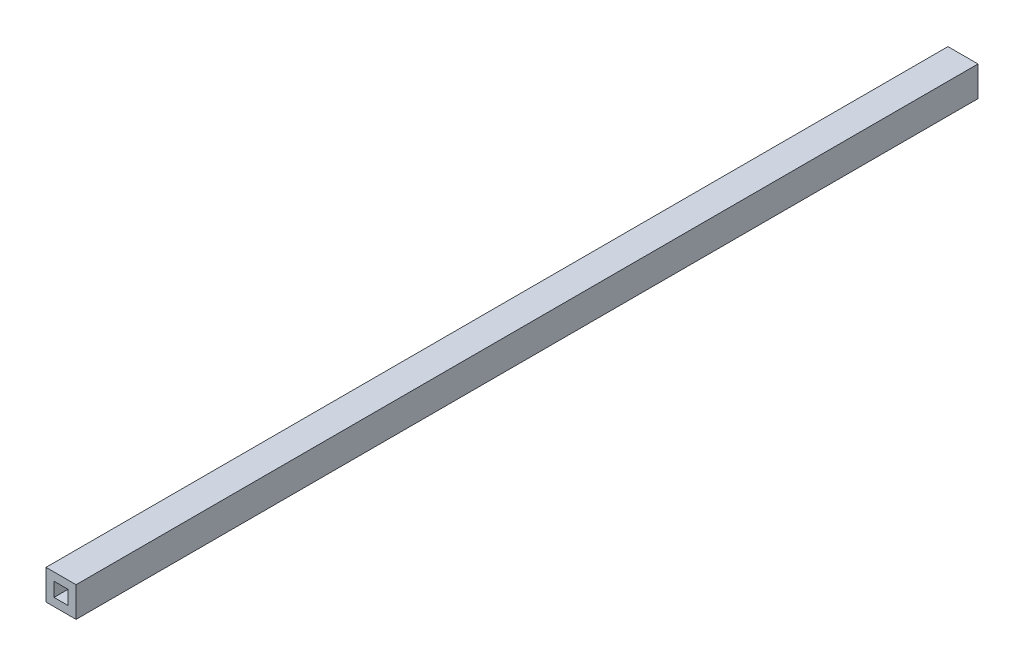
ISO-10303-21;
HEADER;
FILE_DESCRIPTION(('STEP AP214'),'2;1');
FILE_NAME('part.step','',(''),(''),'','','');
FILE_SCHEMA(('AUTOMOTIVE_DESIGN { 1 0 10303 214 1 1 1 1 }'));
ENDSEC;
DATA;
#1=APPLICATION_CONTEXT('core data for automotive mechanical design processes');
#2=APPLICATION_PROTOCOL_DEFINITION('international standard','automotive_design',2000,#1);
#3=PRODUCT_CONTEXT('',#1,'mechanical');
#4=PRODUCT('Part','Part','',(#3));
#5=PRODUCT_RELATED_PRODUCT_CATEGORY('part','',(#4));
#6=PRODUCT_DEFINITION_FORMATION('','',#4);
#7=PRODUCT_DEFINITION_CONTEXT('part definition',#1,'design');
#8=PRODUCT_DEFINITION('design','',#6,#7);
#9=PRODUCT_DEFINITION_SHAPE('','',#8);
#10=(LENGTH_UNIT() NAMED_UNIT(*) SI_UNIT(.MILLI.,.METRE.));
#11=(NAMED_UNIT(*) PLANE_ANGLE_UNIT() SI_UNIT($,.RADIAN.));
#12=(NAMED_UNIT(*) SI_UNIT($,.STERADIAN.) SOLID_ANGLE_UNIT());
#13=UNCERTAINTY_MEASURE_WITH_UNIT(LENGTH_MEASURE(1.E-05),#10,'distance_accuracy_value','');
#14=(GEOMETRIC_REPRESENTATION_CONTEXT(3) GLOBAL_UNCERTAINTY_ASSIGNED_CONTEXT((#13)) GLOBAL_UNIT_ASSIGNED_CONTEXT((#10,
#11,#12)) REPRESENTATION_CONTEXT('',''));
#15=CARTESIAN_POINT('',(0.,0.,0.));
#16=DIRECTION('',(0.,0.,1.));
#17=DIRECTION('',(1.,0.,0.));
#18=AXIS2_PLACEMENT_3D('',#15,#16,#17);
#19=CARTESIAN_POINT('',(0.,0.,571.5));
#20=DIRECTION('',(0.,0.,1.));
#21=DIRECTION('',(1.,0.,0.));
#22=AXIS2_PLACEMENT_3D('',#19,#20,#21);
#23=PLANE('',#22);
#24=DIRECTION('',(0.,-1.,0.));
#25=VECTOR('',#24,1.);
#26=CARTESIAN_POINT('',(-5.94468085106383,3.44521276595745,571.5));
#27=LINE('',#26,#25);
#28=CARTESIAN_POINT('',(-5.94468085106383,3.44521276595745,571.5));
#29=VERTEX_POINT('',#28);
#30=CARTESIAN_POINT('',(-5.94468085106383,-15.6047872340426,571.5));
#31=VERTEX_POINT('',#30);
#32=EDGE_CURVE('E134',#29,#31,#27,.T.);
#33=ORIENTED_EDGE('',*,*,#32,.T.);
#34=DIRECTION('',(1.,0.,0.));
#35=VECTOR('',#34,1.);
#36=CARTESIAN_POINT('',(-5.94468085106383,-15.6047872340426,571.5));
#37=LINE('',#36,#35);
#38=CARTESIAN_POINT('',(13.1053191489362,-15.6047872340426,571.5));
#39=VERTEX_POINT('',#38);
#40=EDGE_CURVE('E137',#31,#39,#37,.T.);
#41=ORIENTED_EDGE('',*,*,#40,.T.);
#42=DIRECTION('',(0.,1.,0.));
#43=VECTOR('',#42,1.);
#44=CARTESIAN_POINT('',(13.1053191489362,3.44521276595745,571.5));
#45=LINE('',#44,#43);
#46=CARTESIAN_POINT('',(13.1053191489362,3.44521276595745,571.5));
#47=VERTEX_POINT('',#46);
#48=EDGE_CURVE('E140',#39,#47,#45,.T.);
#49=ORIENTED_EDGE('',*,*,#48,.T.);
#50=DIRECTION('',(-1.,0.,0.));
#51=VECTOR('',#50,1.);
#52=CARTESIAN_POINT('',(-5.94468085106383,3.44521276595745,571.5));
#53=LINE('',#52,#51);
#54=EDGE_CURVE('E142',#47,#29,#53,.T.);
#55=ORIENTED_EDGE('',*,*,#54,.T.);
#56=EDGE_LOOP('',(#33,#41,#49,#55));
#57=FACE_BOUND('',#56,.T.);
#58=DIRECTION('',(1.,0.,0.));
#59=VECTOR('',#58,1.);
#60=CARTESIAN_POINT('',(-0.864680851063828,-10.5247872340426,571.5));
#61=LINE('',#60,#59);
#62=CARTESIAN_POINT('',(-0.864680851063828,-10.5247872340426,571.5));
#63=VERTEX_POINT('',#62);
#64=CARTESIAN_POINT('',(8.02531914893617,-10.5247872340426,571.5));
#65=VERTEX_POINT('',#64);
#66=EDGE_CURVE('E106',#63,#65,#61,.T.);
#67=ORIENTED_EDGE('',*,*,#66,.F.);
#68=DIRECTION('',(0.,-1.,0.));
#69=VECTOR('',#68,1.);
#70=CARTESIAN_POINT('',(-0.864680851063829,-1.63478723404256,571.5));
#71=LINE('',#70,#69);
#72=CARTESIAN_POINT('',(-0.864680851063829,-1.63478723404256,571.5));
#73=VERTEX_POINT('',#72);
#74=EDGE_CURVE('E98',#73,#63,#71,.T.);
#75=ORIENTED_EDGE('',*,*,#74,.F.);
#76=DIRECTION('',(-1.,0.,0.));
#77=VECTOR('',#76,1.);
#78=CARTESIAN_POINT('',(-0.864680851063829,-1.63478723404256,571.5));
#79=LINE('',#78,#77);
#80=CARTESIAN_POINT('',(8.02531914893617,-1.63478723404255,571.5));
#81=VERTEX_POINT('',#80);
#82=EDGE_CURVE('E120',#81,#73,#79,.T.);
#83=ORIENTED_EDGE('',*,*,#82,.F.);
#84=DIRECTION('',(0.,1.,0.));
#85=VECTOR('',#84,1.);
#86=CARTESIAN_POINT('',(8.02531914893617,-1.63478723404255,571.5));
#87=LINE('',#86,#85);
#88=EDGE_CURVE('E118',#65,#81,#87,.T.);
#89=ORIENTED_EDGE('',*,*,#88,.F.);
#90=EDGE_LOOP('',(#67,#75,#83,#89));
#91=FACE_BOUND('',#90,.T.);
#92=ADVANCED_FACE('F33',(#57,#91),#23,.T.);
#93=CARTESIAN_POINT('',(0.,0.,0.));
#94=DIRECTION('',(0.,0.,1.));
#95=DIRECTION('',(1.,0.,0.));
#96=AXIS2_PLACEMENT_3D('',#93,#94,#95);
#97=PLANE('',#96);
#98=DIRECTION('',(0.,-1.,0.));
#99=VECTOR('',#98,1.);
#100=CARTESIAN_POINT('',(-5.94468085106383,3.44521276595745,0.));
#101=LINE('',#100,#99);
#102=CARTESIAN_POINT('',(-5.94468085106383,3.44521276595745,0.));
#103=VERTEX_POINT('',#102);
#104=CARTESIAN_POINT('',(-5.94468085106383,-15.6047872340426,0.));
#105=VERTEX_POINT('',#104);
#106=EDGE_CURVE('E114',#103,#105,#101,.T.);
#107=ORIENTED_EDGE('',*,*,#106,.F.);
#108=DIRECTION('',(-1.,0.,0.));
#109=VECTOR('',#108,1.);
#110=CARTESIAN_POINT('',(-5.94468085106383,3.44521276595745,0.));
#111=LINE('',#110,#109);
#112=CARTESIAN_POINT('',(13.1053191489362,3.44521276595745,0.));
#113=VERTEX_POINT('',#112);
#114=EDGE_CURVE('E138',#113,#103,#111,.T.);
#115=ORIENTED_EDGE('',*,*,#114,.F.);
#116=DIRECTION('',(0.,1.,0.));
#117=VECTOR('',#116,1.);
#118=CARTESIAN_POINT('',(13.1053191489362,3.44521276595745,0.));
#119=LINE('',#118,#117);
#120=CARTESIAN_POINT('',(13.1053191489362,-15.6047872340426,0.));
#121=VERTEX_POINT('',#120);
#122=EDGE_CURVE('E149',#121,#113,#119,.T.);
#123=ORIENTED_EDGE('',*,*,#122,.F.);
#124=DIRECTION('',(1.,0.,0.));
#125=VECTOR('',#124,1.);
#126=CARTESIAN_POINT('',(-5.94468085106383,-15.6047872340426,0.));
#127=LINE('',#126,#125);
#128=EDGE_CURVE('E147',#105,#121,#127,.T.);
#129=ORIENTED_EDGE('',*,*,#128,.F.);
#130=EDGE_LOOP('',(#107,#115,#123,#129));
#131=FACE_BOUND('',#130,.T.);
#132=DIRECTION('',(0.,-1.,0.));
#133=VECTOR('',#132,1.);
#134=CARTESIAN_POINT('',(-0.864680851063829,-1.63478723404256,0.));
#135=LINE('',#134,#133);
#136=CARTESIAN_POINT('',(-0.864680851063829,-1.63478723404256,0.));
#137=VERTEX_POINT('',#136);
#138=CARTESIAN_POINT('',(-0.864680851063828,-10.5247872340426,0.));
#139=VERTEX_POINT('',#138);
#140=EDGE_CURVE('E56',#137,#139,#135,.T.);
#141=ORIENTED_EDGE('',*,*,#140,.T.);
#142=DIRECTION('',(1.,0.,0.));
#143=VECTOR('',#142,1.);
#144=CARTESIAN_POINT('',(-0.864680851063828,-10.5247872340426,0.));
#145=LINE('',#144,#143);
#146=CARTESIAN_POINT('',(8.02531914893617,-10.5247872340426,0.));
#147=VERTEX_POINT('',#146);
#148=EDGE_CURVE('E113',#139,#147,#145,.T.);
#149=ORIENTED_EDGE('',*,*,#148,.T.);
#150=DIRECTION('',(0.,1.,0.));
#151=VECTOR('',#150,1.);
#152=CARTESIAN_POINT('',(8.02531914893617,-1.63478723404255,0.));
#153=LINE('',#152,#151);
#154=CARTESIAN_POINT('',(8.02531914893617,-1.63478723404255,0.));
#155=VERTEX_POINT('',#154);
#156=EDGE_CURVE('E126',#147,#155,#153,.T.);
#157=ORIENTED_EDGE('',*,*,#156,.T.);
#158=DIRECTION('',(-1.,0.,0.));
#159=VECTOR('',#158,1.);
#160=CARTESIAN_POINT('',(-0.864680851063829,-1.63478723404256,0.));
#161=LINE('',#160,#159);
#162=EDGE_CURVE('E107',#155,#137,#161,.T.);
#163=ORIENTED_EDGE('',*,*,#162,.T.);
#164=EDGE_LOOP('',(#141,#149,#157,#163));
#165=FACE_BOUND('',#164,.T.);
#166=ADVANCED_FACE('F167',(#131,#165),#97,.F.);
#167=CARTESIAN_POINT('',(-5.94468085106383,3.44521276595745,571.5));
#168=DIRECTION('',(1.,0.,0.));
#169=DIRECTION('',(0.,1.,0.));
#170=AXIS2_PLACEMENT_3D('',#167,#168,#169);
#171=PLANE('',#170);
#172=ORIENTED_EDGE('',*,*,#106,.T.);
#173=DIRECTION('',(0.,0.,-1.));
#174=VECTOR('',#173,1.);
#175=CARTESIAN_POINT('',(-5.94468085106383,-15.6047872340426,571.5));
#176=LINE('',#175,#174);
#177=EDGE_CURVE('E11',#31,#105,#176,.T.);
#178=ORIENTED_EDGE('',*,*,#177,.F.);
#179=ORIENTED_EDGE('',*,*,#32,.F.);
#180=DIRECTION('',(0.,0.,-1.));
#181=VECTOR('',#180,1.);
#182=CARTESIAN_POINT('',(-5.94468085106383,3.44521276595745,571.5));
#183=LINE('',#182,#181);
#184=EDGE_CURVE('E144',#29,#103,#183,.T.);
#185=ORIENTED_EDGE('',*,*,#184,.T.);
#186=EDGE_LOOP('',(#172,#178,#179,#185));
#187=FACE_BOUND('',#186,.T.);
#188=ADVANCED_FACE('F35',(#187),#171,.F.);
#189=CARTESIAN_POINT('',(-5.94468085106383,-15.6047872340426,571.5));
#190=DIRECTION('',(0.,1.,0.));
#191=DIRECTION('',(0.,0.,1.));
#192=AXIS2_PLACEMENT_3D('',#189,#190,#191);
#193=PLANE('',#192);
#194=ORIENTED_EDGE('',*,*,#128,.T.);
#195=DIRECTION('',(0.,0.,-1.));
#196=VECTOR('',#195,1.);
#197=CARTESIAN_POINT('',(13.1053191489362,-15.6047872340426,571.5));
#198=LINE('',#197,#196);
#199=EDGE_CURVE('E41',#39,#121,#198,.T.);
#200=ORIENTED_EDGE('',*,*,#199,.F.);
#201=ORIENTED_EDGE('',*,*,#40,.F.);
#202=ORIENTED_EDGE('',*,*,#177,.T.);
#203=EDGE_LOOP('',(#194,#200,#201,#202));
#204=FACE_BOUND('',#203,.T.);
#205=ADVANCED_FACE('F177',(#204),#193,.F.);
#206=CARTESIAN_POINT('',(13.1053191489362,3.44521276595745,571.5));
#207=DIRECTION('',(-1.,0.,0.));
#208=DIRECTION('',(0.,-1.,0.));
#209=AXIS2_PLACEMENT_3D('',#206,#207,#208);
#210=PLANE('',#209);
#211=ORIENTED_EDGE('',*,*,#122,.T.);
#212=DIRECTION('',(0.,0.,-1.));
#213=VECTOR('',#212,1.);
#214=CARTESIAN_POINT('',(13.1053191489362,3.44521276595745,571.5));
#215=LINE('',#214,#213);
#216=EDGE_CURVE('E154',#47,#113,#215,.T.);
#217=ORIENTED_EDGE('',*,*,#216,.F.);
#218=ORIENTED_EDGE('',*,*,#48,.F.);
#219=ORIENTED_EDGE('',*,*,#199,.T.);
#220=EDGE_LOOP('',(#211,#217,#218,#219));
#221=FACE_BOUND('',#220,.T.);
#222=ADVANCED_FACE('F161',(#221),#210,.F.);
#223=CARTESIAN_POINT('',(-5.94468085106383,3.44521276595745,571.5));
#224=DIRECTION('',(0.,-1.,0.));
#225=DIRECTION('',(0.,0.,-1.));
#226=AXIS2_PLACEMENT_3D('',#223,#224,#225);
#227=PLANE('',#226);
#228=ORIENTED_EDGE('',*,*,#114,.T.);
#229=ORIENTED_EDGE('',*,*,#184,.F.);
#230=ORIENTED_EDGE('',*,*,#54,.F.);
#231=ORIENTED_EDGE('',*,*,#216,.T.);
#232=EDGE_LOOP('',(#228,#229,#230,#231));
#233=FACE_BOUND('',#232,.T.);
#234=ADVANCED_FACE('F171',(#233),#227,.F.);
#235=CARTESIAN_POINT('',(-0.864680851063829,-1.63478723404256,571.5));
#236=DIRECTION('',(1.,0.,0.));
#237=DIRECTION('',(0.,1.,0.));
#238=AXIS2_PLACEMENT_3D('',#235,#236,#237);
#239=PLANE('',#238);
#240=ORIENTED_EDGE('',*,*,#140,.F.);
#241=DIRECTION('',(0.,0.,-1.));
#242=VECTOR('',#241,1.);
#243=CARTESIAN_POINT('',(-0.864680851063829,-1.63478723404256,571.5));
#244=LINE('',#243,#242);
#245=EDGE_CURVE('E102',#73,#137,#244,.T.);
#246=ORIENTED_EDGE('',*,*,#245,.F.);
#247=ORIENTED_EDGE('',*,*,#74,.T.);
#248=DIRECTION('',(0.,0.,-1.));
#249=VECTOR('',#248,1.);
#250=CARTESIAN_POINT('',(-0.864680851063828,-10.5247872340426,571.5));
#251=LINE('',#250,#249);
#252=EDGE_CURVE('E101',#63,#139,#251,.T.);
#253=ORIENTED_EDGE('',*,*,#252,.T.);
#254=EDGE_LOOP('',(#240,#246,#247,#253));
#255=FACE_BOUND('',#254,.T.);
#256=ADVANCED_FACE('F100',(#255),#239,.T.);
#257=CARTESIAN_POINT('',(-0.864680851063828,-10.5247872340426,571.5));
#258=DIRECTION('',(0.,1.,0.));
#259=DIRECTION('',(-1.,0.,0.));
#260=AXIS2_PLACEMENT_3D('',#257,#258,#259);
#261=PLANE('',#260);
#262=ORIENTED_EDGE('',*,*,#148,.F.);
#263=ORIENTED_EDGE('',*,*,#252,.F.);
#264=ORIENTED_EDGE('',*,*,#66,.T.);
#265=DIRECTION('',(0.,0.,-1.));
#266=VECTOR('',#265,1.);
#267=CARTESIAN_POINT('',(8.02531914893617,-10.5247872340426,571.5));
#268=LINE('',#267,#266);
#269=EDGE_CURVE('E115',#65,#147,#268,.T.);
#270=ORIENTED_EDGE('',*,*,#269,.T.);
#271=EDGE_LOOP('',(#262,#263,#264,#270));
#272=FACE_BOUND('',#271,.T.);
#273=ADVANCED_FACE('F110',(#272),#261,.T.);
#274=CARTESIAN_POINT('',(8.02531914893617,-1.63478723404255,571.5));
#275=DIRECTION('',(-1.,0.,0.));
#276=DIRECTION('',(0.,-1.,0.));
#277=AXIS2_PLACEMENT_3D('',#274,#275,#276);
#278=PLANE('',#277);
#279=ORIENTED_EDGE('',*,*,#156,.F.);
#280=ORIENTED_EDGE('',*,*,#269,.F.);
#281=ORIENTED_EDGE('',*,*,#88,.T.);
#282=DIRECTION('',(0.,0.,-1.));
#283=VECTOR('',#282,1.);
#284=CARTESIAN_POINT('',(8.02531914893617,-1.63478723404255,571.5));
#285=LINE('',#284,#283);
#286=EDGE_CURVE('E48',#81,#155,#285,.T.);
#287=ORIENTED_EDGE('',*,*,#286,.T.);
#288=EDGE_LOOP('',(#279,#280,#281,#287));
#289=FACE_BOUND('',#288,.T.);
#290=ADVANCED_FACE('F200',(#289),#278,.T.);
#291=CARTESIAN_POINT('',(-0.864680851063829,-1.63478723404256,571.5));
#292=DIRECTION('',(0.,-1.,0.));
#293=DIRECTION('',(1.,0.,0.));
#294=AXIS2_PLACEMENT_3D('',#291,#292,#293);
#295=PLANE('',#294);
#296=ORIENTED_EDGE('',*,*,#162,.F.);
#297=ORIENTED_EDGE('',*,*,#286,.F.);
#298=ORIENTED_EDGE('',*,*,#82,.T.);
#299=ORIENTED_EDGE('',*,*,#245,.T.);
#300=EDGE_LOOP('',(#296,#297,#298,#299));
#301=FACE_BOUND('',#300,.T.);
#302=ADVANCED_FACE('F204',(#301),#295,.T.);
#303=CLOSED_SHELL('',(#92,#166,#188,#205,#222,#234,#256,#273,#290,#302));
#304=MANIFOLD_SOLID_BREP('B2',#303);
#305=ADVANCED_BREP_SHAPE_REPRESENTATION('',(#18,#304),#14);
#306=SHAPE_DEFINITION_REPRESENTATION(#9,#305);
ENDSEC;
END-ISO-10303-21;
